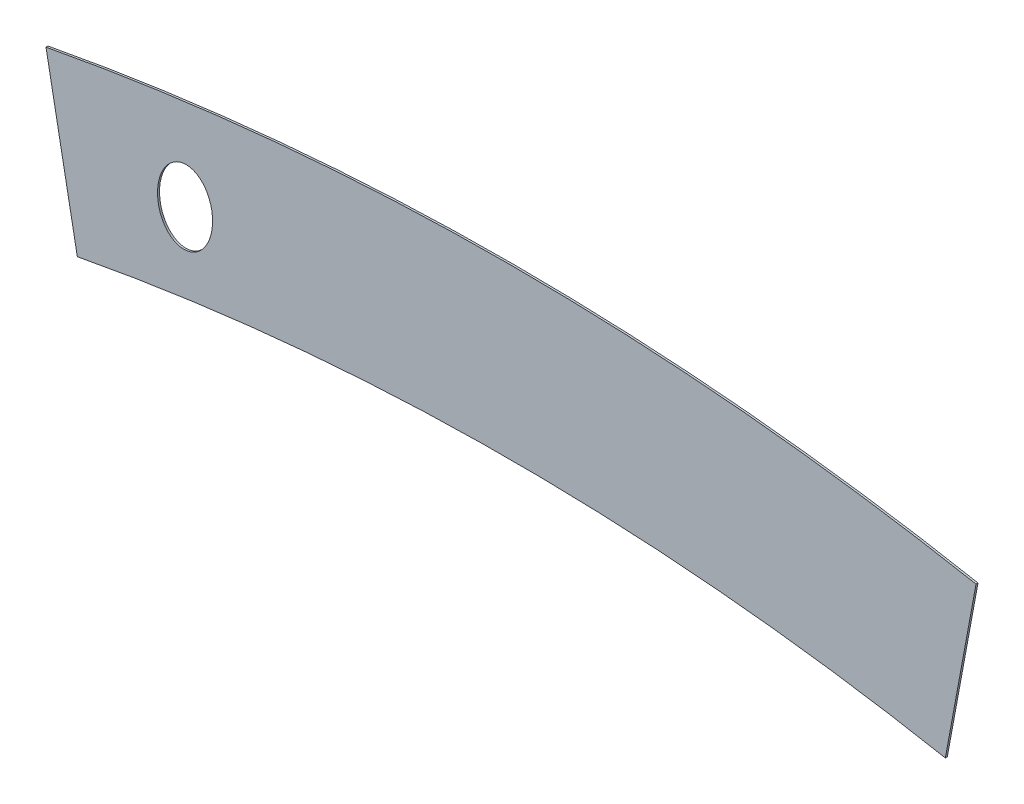
ISO-10303-21;
HEADER;
FILE_DESCRIPTION(('STEP AP214'),'2;1');
FILE_NAME('part.step','',(''),(''),'','','');
FILE_SCHEMA(('AUTOMOTIVE_DESIGN { 1 0 10303 214 1 1 1 1 }'));
ENDSEC;
DATA;
#1=APPLICATION_CONTEXT('core data for automotive mechanical design processes');
#2=APPLICATION_PROTOCOL_DEFINITION('international standard','automotive_design',2000,#1);
#3=PRODUCT_CONTEXT('',#1,'mechanical');
#4=PRODUCT('Part','Part','',(#3));
#5=PRODUCT_RELATED_PRODUCT_CATEGORY('part','',(#4));
#6=PRODUCT_DEFINITION_FORMATION('','',#4);
#7=PRODUCT_DEFINITION_CONTEXT('part definition',#1,'design');
#8=PRODUCT_DEFINITION('design','',#6,#7);
#9=PRODUCT_DEFINITION_SHAPE('','',#8);
#10=(LENGTH_UNIT() NAMED_UNIT(*) SI_UNIT(.MILLI.,.METRE.));
#11=(NAMED_UNIT(*) PLANE_ANGLE_UNIT() SI_UNIT($,.RADIAN.));
#12=(NAMED_UNIT(*) SI_UNIT($,.STERADIAN.) SOLID_ANGLE_UNIT());
#13=UNCERTAINTY_MEASURE_WITH_UNIT(LENGTH_MEASURE(1.E-05),#10,'distance_accuracy_value','');
#14=(GEOMETRIC_REPRESENTATION_CONTEXT(3) GLOBAL_UNCERTAINTY_ASSIGNED_CONTEXT((#13)) GLOBAL_UNIT_ASSIGNED_CONTEXT((#10,
#11,#12)) REPRESENTATION_CONTEXT('',''));
#15=CARTESIAN_POINT('',(0.,0.,0.));
#16=DIRECTION('',(0.,0.,1.));
#17=DIRECTION('',(1.,0.,0.));
#18=AXIS2_PLACEMENT_3D('',#15,#16,#17);
#19=CARTESIAN_POINT('',(1.23550620759584E-12,-4035.6028,-3.175));
#20=DIRECTION('',(0.,0.,1.));
#21=DIRECTION('',(1.,0.,0.));
#22=AXIS2_PLACEMENT_3D('',#19,#20,#21);
#23=CYLINDRICAL_SURFACE('',#22,4035.6028);
#24=CARTESIAN_POINT('',(1.23550620759584E-12,-4035.6028,0.));
#25=DIRECTION('',(0.,0.,1.));
#26=DIRECTION('',(1.,0.,0.));
#27=AXIS2_PLACEMENT_3D('',#24,#25,#26);
#28=CIRCLE('',#27,4035.6028);
#29=CARTESIAN_POINT('',(752.475,-70.7735055986837,0.));
#30=VERTEX_POINT('',#29);
#31=CARTESIAN_POINT('',(-752.475,-70.7735055986839,0.));
#32=VERTEX_POINT('',#31);
#33=EDGE_CURVE('E72',#30,#32,#28,.T.);
#34=ORIENTED_EDGE('',*,*,#33,.F.);
#35=DIRECTION('',(0.,0.,1.));
#36=VECTOR('',#35,1.);
#37=CARTESIAN_POINT('',(752.475,-70.7735055986837,-3.175));
#38=LINE('',#37,#36);
#39=CARTESIAN_POINT('',(752.475,-70.7735055986837,-3.175));
#40=VERTEX_POINT('',#39);
#41=EDGE_CURVE('E11',#40,#30,#38,.T.);
#42=ORIENTED_EDGE('',*,*,#41,.F.);
#43=CARTESIAN_POINT('',(1.23550620759584E-12,-4035.6028,-3.175));
#44=DIRECTION('',(0.,0.,1.));
#45=DIRECTION('',(1.,0.,0.));
#46=AXIS2_PLACEMENT_3D('',#43,#44,#45);
#47=CIRCLE('',#46,4035.6028);
#48=CARTESIAN_POINT('',(-752.475,-70.7735055986839,-3.175));
#49=VERTEX_POINT('',#48);
#50=EDGE_CURVE('E74',#40,#49,#47,.T.);
#51=ORIENTED_EDGE('',*,*,#50,.T.);
#52=DIRECTION('',(0.,0.,1.));
#53=VECTOR('',#52,1.);
#54=CARTESIAN_POINT('',(-752.475,-70.7735055986839,-3.175));
#55=LINE('',#54,#53);
#56=EDGE_CURVE('E35',#49,#32,#55,.T.);
#57=ORIENTED_EDGE('',*,*,#56,.T.);
#58=EDGE_LOOP('',(#34,#42,#51,#57));
#59=FACE_BOUND('',#58,.T.);
#60=ADVANCED_FACE('F32',(#59),#23,.T.);
#61=CARTESIAN_POINT('',(752.475,-70.7735055986837,-3.175));
#62=DIRECTION('',(0.983324742118489,-0.181858328205246,0.));
#63=DIRECTION('',(0.181858328205246,0.983324742118489,0.));
#64=AXIS2_PLACEMENT_3D('',#61,#62,#63);
#65=PLANE('',#64);
#66=DIRECTION('',(0.181858328205246,0.983324742118489,0.));
#67=VECTOR('',#66,1.);
#68=CARTESIAN_POINT('',(752.475,-70.7735055986837,0.));
#69=LINE('',#68,#67);
#70=CARTESIAN_POINT('',(702.818,-339.273481383511,0.));
#71=VERTEX_POINT('',#70);
#72=EDGE_CURVE('E89',#71,#30,#69,.T.);
#73=ORIENTED_EDGE('',*,*,#72,.F.);
#74=DIRECTION('',(0.,0.,1.));
#75=VECTOR('',#74,1.);
#76=CARTESIAN_POINT('',(702.818,-339.273481383511,-3.175));
#77=LINE('',#76,#75);
#78=CARTESIAN_POINT('',(702.818,-339.273481383511,-3.175));
#79=VERTEX_POINT('',#78);
#80=EDGE_CURVE('E40',#79,#71,#77,.T.);
#81=ORIENTED_EDGE('',*,*,#80,.F.);
#82=DIRECTION('',(0.181858328205246,0.983324742118489,0.));
#83=VECTOR('',#82,1.);
#84=CARTESIAN_POINT('',(752.475,-70.7735055986837,-3.175));
#85=LINE('',#84,#83);
#86=EDGE_CURVE('E79',#79,#40,#85,.T.);
#87=ORIENTED_EDGE('',*,*,#86,.T.);
#88=ORIENTED_EDGE('',*,*,#41,.T.);
#89=EDGE_LOOP('',(#73,#81,#87,#88));
#90=FACE_BOUND('',#89,.T.);
#91=ADVANCED_FACE('F110',(#90),#65,.T.);
#92=CARTESIAN_POINT('',(1.23550620759584E-12,-4035.6028,-3.175));
#93=DIRECTION('',(0.,0.,1.));
#94=DIRECTION('',(1.,0.,0.));
#95=AXIS2_PLACEMENT_3D('',#92,#93,#94);
#96=CYLINDRICAL_SURFACE('',#95,3762.5528);
#97=CARTESIAN_POINT('',(1.23550620759584E-12,-4035.6028,0.));
#98=DIRECTION('',(0.,0.,-1.));
#99=DIRECTION('',(1.,0.,0.));
#100=AXIS2_PLACEMENT_3D('',#97,#98,#99);
#101=CIRCLE('',#100,3762.5528);
#102=CARTESIAN_POINT('',(-701.7766,-339.075622163988,0.));
#103=VERTEX_POINT('',#102);
#104=EDGE_CURVE('E86',#103,#71,#101,.T.);
#105=ORIENTED_EDGE('',*,*,#104,.F.);
#106=DIRECTION('',(0.,0.,1.));
#107=VECTOR('',#106,1.);
#108=CARTESIAN_POINT('',(-701.7766,-339.075622163988,-3.175));
#109=LINE('',#108,#107);
#110=CARTESIAN_POINT('',(-701.7766,-339.075622163988,-3.175));
#111=VERTEX_POINT('',#110);
#112=EDGE_CURVE('E78',#111,#103,#109,.T.);
#113=ORIENTED_EDGE('',*,*,#112,.F.);
#114=CARTESIAN_POINT('',(1.23550620759584E-12,-4035.6028,-3.175));
#115=DIRECTION('',(0.,0.,-1.));
#116=DIRECTION('',(1.,0.,0.));
#117=AXIS2_PLACEMENT_3D('',#114,#115,#116);
#118=CIRCLE('',#117,3762.5528);
#119=EDGE_CURVE('E103',#111,#79,#118,.T.);
#120=ORIENTED_EDGE('',*,*,#119,.T.);
#121=ORIENTED_EDGE('',*,*,#80,.T.);
#122=EDGE_LOOP('',(#105,#113,#120,#121));
#123=FACE_BOUND('',#122,.T.);
#124=ADVANCED_FACE('F107',(#123),#96,.F.);
#125=CARTESIAN_POINT('',(-752.475,-70.7735055986839,-3.175));
#126=DIRECTION('',(-0.982611334081642,-0.185674355079788,0.));
#127=DIRECTION('',(0.185674355079788,-0.982611334081642,0.));
#128=AXIS2_PLACEMENT_3D('',#125,#126,#127);
#129=PLANE('',#128);
#130=DIRECTION('',(0.185674355079788,-0.982611334081642,0.));
#131=VECTOR('',#130,1.);
#132=CARTESIAN_POINT('',(-752.475,-70.7735055986839,0.));
#133=LINE('',#132,#131);
#134=EDGE_CURVE('E81',#32,#103,#133,.T.);
#135=ORIENTED_EDGE('',*,*,#134,.F.);
#136=ORIENTED_EDGE('',*,*,#56,.F.);
#137=DIRECTION('',(0.185674355079788,-0.982611334081642,0.));
#138=VECTOR('',#137,1.);
#139=CARTESIAN_POINT('',(-752.475,-70.7735055986839,-3.175));
#140=LINE('',#139,#138);
#141=EDGE_CURVE('E101',#49,#111,#140,.T.);
#142=ORIENTED_EDGE('',*,*,#141,.T.);
#143=ORIENTED_EDGE('',*,*,#112,.T.);
#144=EDGE_LOOP('',(#135,#136,#142,#143));
#145=FACE_BOUND('',#144,.T.);
#146=ADVANCED_FACE('F82',(#145),#129,.T.);
#147=CARTESIAN_POINT('',(1.23550620759584E-12,-4035.6028,-3.175));
#148=DIRECTION('',(0.,0.,1.));
#149=DIRECTION('',(1.,0.,0.));
#150=AXIS2_PLACEMENT_3D('',#147,#148,#149);
#151=PLANE('',#150);
#152=CARTESIAN_POINT('',(-527.440710052146,-182.216417238024,-3.175));
#153=DIRECTION('',(0.,0.,1.));
#154=DIRECTION('',(-0.0664480485987353,-0.997789886117022,0.));
#155=AXIS2_PLACEMENT_3D('',#152,#153,#154);
#156=ELLIPSE('',#155,60.325,44.45);
#157=CARTESIAN_POINT('',(-531.449188583865,-242.408092118033,-3.175));
#158=VERTEX_POINT('',#157);
#159=EDGE_CURVE('E90',#158,#158,#156,.T.);
#160=ORIENTED_EDGE('',*,*,#159,.T.);
#161=EDGE_LOOP('',(#160));
#162=FACE_BOUND('',#161,.T.);
#163=ORIENTED_EDGE('',*,*,#50,.F.);
#164=ORIENTED_EDGE('',*,*,#86,.F.);
#165=ORIENTED_EDGE('',*,*,#119,.F.);
#166=ORIENTED_EDGE('',*,*,#141,.F.);
#167=EDGE_LOOP('',(#163,#164,#165,#166));
#168=FACE_BOUND('',#167,.T.);
#169=ADVANCED_FACE('F112',(#162,#168),#151,.F.);
#170=CARTESIAN_POINT('',(1.23550620759584E-12,-4035.6028,0.));
#171=DIRECTION('',(0.,0.,1.));
#172=DIRECTION('',(1.,0.,0.));
#173=AXIS2_PLACEMENT_3D('',#170,#171,#172);
#174=PLANE('',#173);
#175=CARTESIAN_POINT('',(-527.440710052146,-182.216417238024,0.));
#176=DIRECTION('',(0.,0.,1.));
#177=DIRECTION('',(-0.0664480485987353,-0.997789886117022,0.));
#178=AXIS2_PLACEMENT_3D('',#175,#176,#177);
#179=ELLIPSE('',#178,60.325,44.45);
#180=CARTESIAN_POINT('',(-531.449188583865,-242.408092118033,0.));
#181=VERTEX_POINT('',#180);
#182=EDGE_CURVE('E93',#181,#181,#179,.T.);
#183=ORIENTED_EDGE('',*,*,#182,.F.);
#184=EDGE_LOOP('',(#183));
#185=FACE_BOUND('',#184,.T.);
#186=ORIENTED_EDGE('',*,*,#33,.T.);
#187=ORIENTED_EDGE('',*,*,#134,.T.);
#188=ORIENTED_EDGE('',*,*,#104,.T.);
#189=ORIENTED_EDGE('',*,*,#72,.T.);
#190=EDGE_LOOP('',(#186,#187,#188,#189));
#191=FACE_BOUND('',#190,.T.);
#192=ADVANCED_FACE('F88',(#185,#191),#174,.T.);
#193=DIRECTION('',(0.,0.,1.));
#194=VECTOR('',#193,1.);
#195=SURFACE_OF_LINEAR_EXTRUSION('',#156,#194);
#196=ORIENTED_EDGE('',*,*,#159,.F.);
#197=EDGE_LOOP('',(#196));
#198=FACE_BOUND('',#197,.T.);
#199=ORIENTED_EDGE('',*,*,#182,.T.);
#200=EDGE_LOOP('',(#199));
#201=FACE_BOUND('',#200,.T.);
#202=ADVANCED_FACE('F120',(#198,#201),#195,.F.);
#203=CLOSED_SHELL('',(#60,#91,#124,#146,#169,#192,#202));
#204=MANIFOLD_SOLID_BREP('B2',#203);
#205=ADVANCED_BREP_SHAPE_REPRESENTATION('',(#18,#204),#14);
#206=SHAPE_DEFINITION_REPRESENTATION(#9,#205);
ENDSEC;
END-ISO-10303-21;
